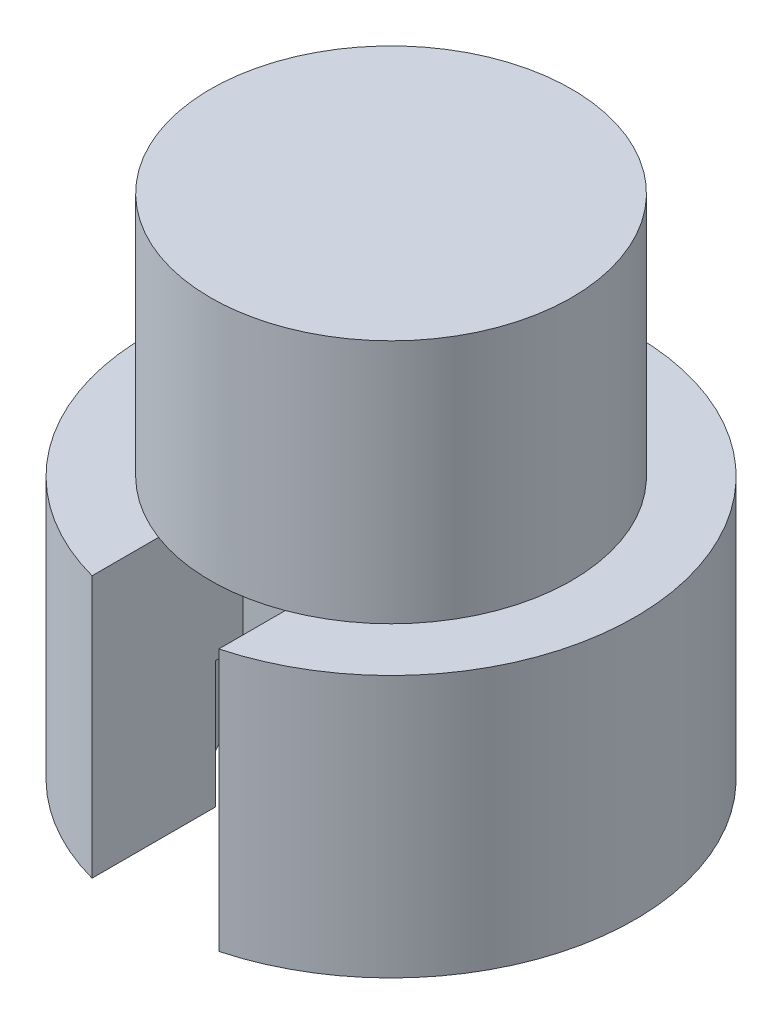
ISO-10303-21;
HEADER;
FILE_DESCRIPTION(('STEP AP214'),'2;1');
FILE_NAME('part.step','',(''),(''),'','','');
FILE_SCHEMA(('AUTOMOTIVE_DESIGN { 1 0 10303 214 1 1 1 1 }'));
ENDSEC;
DATA;
#1=APPLICATION_CONTEXT('core data for automotive mechanical design processes');
#2=APPLICATION_PROTOCOL_DEFINITION('international standard','automotive_design',2000,#1);
#3=PRODUCT_CONTEXT('',#1,'mechanical');
#4=PRODUCT('Part','Part','',(#3));
#5=PRODUCT_RELATED_PRODUCT_CATEGORY('part','',(#4));
#6=PRODUCT_DEFINITION_FORMATION('','',#4);
#7=PRODUCT_DEFINITION_CONTEXT('part definition',#1,'design');
#8=PRODUCT_DEFINITION('design','',#6,#7);
#9=PRODUCT_DEFINITION_SHAPE('','',#8);
#10=(LENGTH_UNIT() NAMED_UNIT(*) SI_UNIT(.MILLI.,.METRE.));
#11=(NAMED_UNIT(*) PLANE_ANGLE_UNIT() SI_UNIT($,.RADIAN.));
#12=(NAMED_UNIT(*) SI_UNIT($,.STERADIAN.) SOLID_ANGLE_UNIT());
#13=UNCERTAINTY_MEASURE_WITH_UNIT(LENGTH_MEASURE(1.E-05),#10,'distance_accuracy_value','');
#14=(GEOMETRIC_REPRESENTATION_CONTEXT(3) GLOBAL_UNCERTAINTY_ASSIGNED_CONTEXT((#13)) GLOBAL_UNIT_ASSIGNED_CONTEXT((#10,
#11,#12)) REPRESENTATION_CONTEXT('',''));
#15=CARTESIAN_POINT('',(0.,0.,0.));
#16=DIRECTION('',(0.,0.,1.));
#17=DIRECTION('',(1.,0.,0.));
#18=AXIS2_PLACEMENT_3D('',#15,#16,#17);
#19=CARTESIAN_POINT('',(0.,12.,0.));
#20=DIRECTION('',(0.,-1.,0.));
#21=DIRECTION('',(0.,0.,-1.));
#22=AXIS2_PLACEMENT_3D('',#19,#20,#21);
#23=CYLINDRICAL_SURFACE('',#22,4.275);
#24=CARTESIAN_POINT('',(0.,12.,0.));
#25=DIRECTION('',(0.,1.,0.));
#26=DIRECTION('',(0.,0.,1.));
#27=AXIS2_PLACEMENT_3D('',#24,#25,#26);
#28=CIRCLE('',#27,4.275);
#29=CARTESIAN_POINT('',(0.,12.,4.275));
#30=VERTEX_POINT('',#29);
#31=EDGE_CURVE('E164',#30,#30,#28,.T.);
#32=ORIENTED_EDGE('',*,*,#31,.F.);
#33=EDGE_LOOP('',(#32));
#34=FACE_BOUND('',#33,.T.);
#35=CARTESIAN_POINT('',(0.,6.2,0.));
#36=DIRECTION('',(0.,-1.,0.));
#37=DIRECTION('',(0.,0.,-1.));
#38=AXIS2_PLACEMENT_3D('',#35,#36,#37);
#39=CIRCLE('',#38,4.275);
#40=CARTESIAN_POINT('',(1.5,6.2,4.00320184352475));
#41=VERTEX_POINT('',#40);
#42=CARTESIAN_POINT('',(-1.5,6.2,4.00320184352475));
#43=VERTEX_POINT('',#42);
#44=EDGE_CURVE('E172',#41,#43,#39,.T.);
#45=ORIENTED_EDGE('',*,*,#44,.F.);
#46=EDGE_CURVE('E171',#43,#41,#39,.T.);
#47=ORIENTED_EDGE('',*,*,#46,.F.);
#48=EDGE_LOOP('',(#45,#47));
#49=FACE_BOUND('',#48,.T.);
#50=ADVANCED_FACE('F45',(#34,#49),#23,.T.);
#51=CARTESIAN_POINT('',(0.,12.,0.));
#52=DIRECTION('',(0.,1.,0.));
#53=DIRECTION('',(0.,0.,1.));
#54=AXIS2_PLACEMENT_3D('',#51,#52,#53);
#55=PLANE('',#54);
#56=ORIENTED_EDGE('',*,*,#31,.T.);
#57=EDGE_LOOP('',(#56));
#58=FACE_BOUND('',#57,.T.);
#59=ADVANCED_FACE('F212',(#58),#55,.T.);
#60=CARTESIAN_POINT('',(0.,6.2,0.));
#61=DIRECTION('',(0.,-1.,0.));
#62=DIRECTION('',(0.,0.,-1.));
#63=AXIS2_PLACEMENT_3D('',#60,#61,#62);
#64=CYLINDRICAL_SURFACE('',#63,5.775);
#65=DIRECTION('',(0.,-1.,0.));
#66=VECTOR('',#65,1.);
#67=CARTESIAN_POINT('',(-1.5,6.2,5.57679343350639));
#68=LINE('',#67,#66);
#69=CARTESIAN_POINT('',(-1.5,6.2,5.57679343350639));
#70=VERTEX_POINT('',#69);
#71=CARTESIAN_POINT('',(-1.5,0.,5.57679343350639));
#72=VERTEX_POINT('',#71);
#73=EDGE_CURVE('E148',#70,#72,#68,.T.);
#74=ORIENTED_EDGE('',*,*,#73,.F.);
#75=CARTESIAN_POINT('',(0.,6.2,0.));
#76=DIRECTION('',(0.,-1.,0.));
#77=DIRECTION('',(0.,0.,-1.));
#78=AXIS2_PLACEMENT_3D('',#75,#76,#77);
#79=CIRCLE('',#78,5.775);
#80=CARTESIAN_POINT('',(1.5,6.2,5.57679343350639));
#81=VERTEX_POINT('',#80);
#82=EDGE_CURVE('E160',#70,#81,#79,.T.);
#83=ORIENTED_EDGE('',*,*,#82,.T.);
#84=DIRECTION('',(0.,-1.,0.));
#85=VECTOR('',#84,1.);
#86=CARTESIAN_POINT('',(1.5,6.2,5.57679343350639));
#87=LINE('',#86,#85);
#88=CARTESIAN_POINT('',(1.5,0.,5.57679343350639));
#89=VERTEX_POINT('',#88);
#90=EDGE_CURVE('E143',#89,#81,#87,.F.);
#91=ORIENTED_EDGE('',*,*,#90,.F.);
#92=CARTESIAN_POINT('',(0.,0.,0.));
#93=DIRECTION('',(0.,-1.,0.));
#94=DIRECTION('',(0.,0.,-1.));
#95=AXIS2_PLACEMENT_3D('',#92,#93,#94);
#96=CIRCLE('',#95,5.775);
#97=EDGE_CURVE('E156',#72,#89,#96,.T.);
#98=ORIENTED_EDGE('',*,*,#97,.F.);
#99=EDGE_LOOP('',(#74,#83,#91,#98));
#100=FACE_BOUND('',#99,.T.);
#101=ADVANCED_FACE('F199',(#100),#64,.T.);
#102=CARTESIAN_POINT('',(0.,6.2,0.));
#103=DIRECTION('',(0.,-1.,0.));
#104=DIRECTION('',(0.,0.,-1.));
#105=AXIS2_PLACEMENT_3D('',#102,#103,#104);
#106=PLANE('',#105);
#107=ORIENTED_EDGE('',*,*,#82,.F.);
#108=DIRECTION('',(0.,0.,1.));
#109=VECTOR('',#108,1.);
#110=CARTESIAN_POINT('',(-1.5,6.2,2.));
#111=LINE('',#110,#109);
#112=EDGE_CURVE('E121',#43,#70,#111,.T.);
#113=ORIENTED_EDGE('',*,*,#112,.F.);
#114=ORIENTED_EDGE('',*,*,#46,.T.);
#115=DIRECTION('',(0.,0.,1.));
#116=VECTOR('',#115,1.);
#117=CARTESIAN_POINT('',(1.5,6.2,2.));
#118=LINE('',#117,#116);
#119=EDGE_CURVE('E117',#41,#81,#118,.T.);
#120=ORIENTED_EDGE('',*,*,#119,.T.);
#121=EDGE_LOOP('',(#107,#113,#114,#120));
#122=FACE_BOUND('',#121,.T.);
#123=ADVANCED_FACE('F191',(#122),#106,.F.);
#124=CARTESIAN_POINT('',(0.,0.,0.));
#125=DIRECTION('',(0.,1.,0.));
#126=DIRECTION('',(0.,0.,1.));
#127=AXIS2_PLACEMENT_3D('',#124,#125,#126);
#128=PLANE('',#127);
#129=CARTESIAN_POINT('',(0.,0.,0.));
#130=DIRECTION('',(0.,-1.,0.));
#131=DIRECTION('',(0.,0.,-1.));
#132=AXIS2_PLACEMENT_3D('',#129,#130,#131);
#133=CIRCLE('',#132,3.05);
#134=CARTESIAN_POINT('',(-1.5,0.,2.6556543449779));
#135=VERTEX_POINT('',#134);
#136=CARTESIAN_POINT('',(1.5,0.,2.6556543449779));
#137=VERTEX_POINT('',#136);
#138=EDGE_CURVE('E151',#135,#137,#133,.T.);
#139=ORIENTED_EDGE('',*,*,#138,.F.);
#140=DIRECTION('',(0.,0.,1.));
#141=VECTOR('',#140,1.);
#142=CARTESIAN_POINT('',(-1.5,0.,2.));
#143=LINE('',#142,#141);
#144=EDGE_CURVE('E127',#135,#72,#143,.T.);
#145=ORIENTED_EDGE('',*,*,#144,.T.);
#146=ORIENTED_EDGE('',*,*,#97,.T.);
#147=DIRECTION('',(0.,0.,1.));
#148=VECTOR('',#147,1.);
#149=CARTESIAN_POINT('',(1.5,0.,2.));
#150=LINE('',#149,#148);
#151=EDGE_CURVE('E131',#137,#89,#150,.T.);
#152=ORIENTED_EDGE('',*,*,#151,.F.);
#153=EDGE_LOOP('',(#139,#145,#146,#152));
#154=FACE_BOUND('',#153,.T.);
#155=ADVANCED_FACE('F202',(#154),#128,.F.);
#156=CARTESIAN_POINT('',(0.,3.,0.));
#157=DIRECTION('',(0.,-1.,0.));
#158=DIRECTION('',(0.,0.,-1.));
#159=AXIS2_PLACEMENT_3D('',#156,#157,#158);
#160=CYLINDRICAL_SURFACE('',#159,3.05);
#161=CARTESIAN_POINT('',(0.,3.,0.));
#162=DIRECTION('',(0.,-1.,0.));
#163=DIRECTION('',(0.,0.,-1.));
#164=AXIS2_PLACEMENT_3D('',#161,#162,#163);
#165=CIRCLE('',#164,3.05);
#166=CARTESIAN_POINT('',(-1.5,3.,2.6556543449779));
#167=VERTEX_POINT('',#166);
#168=CARTESIAN_POINT('',(1.5,3.,2.6556543449779));
#169=VERTEX_POINT('',#168);
#170=EDGE_CURVE('E152',#167,#169,#165,.T.);
#171=ORIENTED_EDGE('',*,*,#170,.F.);
#172=DIRECTION('',(0.,-1.,0.));
#173=VECTOR('',#172,1.);
#174=CARTESIAN_POINT('',(-1.5,3.,2.6556543449779));
#175=LINE('',#174,#173);
#176=EDGE_CURVE('E66',#167,#135,#175,.T.);
#177=ORIENTED_EDGE('',*,*,#176,.T.);
#178=ORIENTED_EDGE('',*,*,#138,.T.);
#179=DIRECTION('',(0.,-1.,0.));
#180=VECTOR('',#179,1.);
#181=CARTESIAN_POINT('',(1.5,3.,2.6556543449779));
#182=LINE('',#181,#180);
#183=EDGE_CURVE('E136',#137,#169,#182,.F.);
#184=ORIENTED_EDGE('',*,*,#183,.T.);
#185=EDGE_LOOP('',(#171,#177,#178,#184));
#186=FACE_BOUND('',#185,.T.);
#187=ADVANCED_FACE('F181',(#186),#160,.F.);
#188=CARTESIAN_POINT('',(0.,3.,0.));
#189=DIRECTION('',(0.,-1.,0.));
#190=DIRECTION('',(0.,0.,-1.));
#191=AXIS2_PLACEMENT_3D('',#188,#189,#190);
#192=PLANE('',#191);
#193=DIRECTION('',(0.,0.,-1.));
#194=VECTOR('',#193,1.);
#195=CARTESIAN_POINT('',(-1.5,3.,0.));
#196=LINE('',#195,#194);
#197=CARTESIAN_POINT('',(-1.5,3.,2.));
#198=VERTEX_POINT('',#197);
#199=EDGE_CURVE('E11',#167,#198,#196,.T.);
#200=ORIENTED_EDGE('',*,*,#199,.F.);
#201=ORIENTED_EDGE('',*,*,#170,.T.);
#202=DIRECTION('',(0.,0.,1.));
#203=VECTOR('',#202,1.);
#204=CARTESIAN_POINT('',(1.5,3.,0.));
#205=LINE('',#204,#203);
#206=CARTESIAN_POINT('',(1.5,3.,2.));
#207=VERTEX_POINT('',#206);
#208=EDGE_CURVE('E53',#207,#169,#205,.T.);
#209=ORIENTED_EDGE('',*,*,#208,.F.);
#210=DIRECTION('',(-1.,0.,0.));
#211=VECTOR('',#210,1.);
#212=CARTESIAN_POINT('',(0.,3.,2.));
#213=LINE('',#212,#211);
#214=EDGE_CURVE('E108',#207,#198,#213,.T.);
#215=ORIENTED_EDGE('',*,*,#214,.T.);
#216=EDGE_LOOP('',(#200,#201,#209,#215));
#217=FACE_BOUND('',#216,.T.);
#218=ADVANCED_FACE('F183',(#217),#192,.T.);
#219=CARTESIAN_POINT('',(-1.5,6.2,2.));
#220=DIRECTION('',(0.,1.,0.));
#221=DIRECTION('',(0.,0.,1.));
#222=AXIS2_PLACEMENT_3D('',#219,#220,#221);
#223=PLANE('',#222);
#224=CARTESIAN_POINT('',(-1.5,6.2,2.));
#225=VERTEX_POINT('',#224);
#226=EDGE_CURVE('E125',#225,#43,#111,.T.);
#227=ORIENTED_EDGE('',*,*,#226,.F.);
#228=DIRECTION('',(-1.,0.,0.));
#229=VECTOR('',#228,1.);
#230=CARTESIAN_POINT('',(-1.5,6.2,2.));
#231=LINE('',#230,#229);
#232=CARTESIAN_POINT('',(1.5,6.2,2.));
#233=VERTEX_POINT('',#232);
#234=EDGE_CURVE('E106',#233,#225,#231,.T.);
#235=ORIENTED_EDGE('',*,*,#234,.F.);
#236=EDGE_CURVE('E114',#233,#41,#118,.T.);
#237=ORIENTED_EDGE('',*,*,#236,.T.);
#238=ORIENTED_EDGE('',*,*,#44,.T.);
#239=EDGE_LOOP('',(#227,#235,#237,#238));
#240=FACE_BOUND('',#239,.T.);
#241=ADVANCED_FACE('F123',(#240),#223,.F.);
#242=CARTESIAN_POINT('',(-1.5,6.2,2.));
#243=DIRECTION('',(-1.,0.,0.));
#244=DIRECTION('',(0.,-1.,0.));
#245=AXIS2_PLACEMENT_3D('',#242,#243,#244);
#246=PLANE('',#245);
#247=ORIENTED_EDGE('',*,*,#73,.T.);
#248=ORIENTED_EDGE('',*,*,#144,.F.);
#249=ORIENTED_EDGE('',*,*,#176,.F.);
#250=ORIENTED_EDGE('',*,*,#199,.T.);
#251=DIRECTION('',(0.,-1.,0.));
#252=VECTOR('',#251,1.);
#253=CARTESIAN_POINT('',(-1.5,6.2,2.));
#254=LINE('',#253,#252);
#255=EDGE_CURVE('E60',#225,#198,#254,.T.);
#256=ORIENTED_EDGE('',*,*,#255,.F.);
#257=ORIENTED_EDGE('',*,*,#226,.T.);
#258=ORIENTED_EDGE('',*,*,#112,.T.);
#259=EDGE_LOOP('',(#247,#248,#249,#250,#256,#257,#258));
#260=FACE_BOUND('',#259,.T.);
#261=ADVANCED_FACE('F184',(#260),#246,.F.);
#262=CARTESIAN_POINT('',(1.5,6.2,2.));
#263=DIRECTION('',(1.,0.,0.));
#264=DIRECTION('',(0.,1.,0.));
#265=AXIS2_PLACEMENT_3D('',#262,#263,#264);
#266=PLANE('',#265);
#267=ORIENTED_EDGE('',*,*,#90,.T.);
#268=ORIENTED_EDGE('',*,*,#119,.F.);
#269=ORIENTED_EDGE('',*,*,#236,.F.);
#270=DIRECTION('',(0.,1.,0.));
#271=VECTOR('',#270,1.);
#272=CARTESIAN_POINT('',(1.5,6.2,2.));
#273=LINE('',#272,#271);
#274=EDGE_CURVE('E102',#207,#233,#273,.T.);
#275=ORIENTED_EDGE('',*,*,#274,.F.);
#276=ORIENTED_EDGE('',*,*,#208,.T.);
#277=ORIENTED_EDGE('',*,*,#183,.F.);
#278=ORIENTED_EDGE('',*,*,#151,.T.);
#279=EDGE_LOOP('',(#267,#268,#269,#275,#276,#277,#278));
#280=FACE_BOUND('',#279,.T.);
#281=ADVANCED_FACE('F115',(#280),#266,.F.);
#282=CARTESIAN_POINT('',(0.,0.,2.));
#283=DIRECTION('',(0.,0.,1.));
#284=DIRECTION('',(1.,0.,0.));
#285=AXIS2_PLACEMENT_3D('',#282,#283,#284);
#286=PLANE('',#285);
#287=ORIENTED_EDGE('',*,*,#274,.T.);
#288=ORIENTED_EDGE('',*,*,#234,.T.);
#289=ORIENTED_EDGE('',*,*,#255,.T.);
#290=ORIENTED_EDGE('',*,*,#214,.F.);
#291=EDGE_LOOP('',(#287,#288,#289,#290));
#292=FACE_BOUND('',#291,.T.);
#293=ADVANCED_FACE('F104',(#292),#286,.T.);
#294=CLOSED_SHELL('',(#50,#59,#101,#123,#155,#187,#218,#241,#261,#281,#293));
#295=MANIFOLD_SOLID_BREP('B2',#294);
#296=ADVANCED_BREP_SHAPE_REPRESENTATION('',(#18,#295),#14);
#297=SHAPE_DEFINITION_REPRESENTATION(#9,#296);
ENDSEC;
END-ISO-10303-21;
